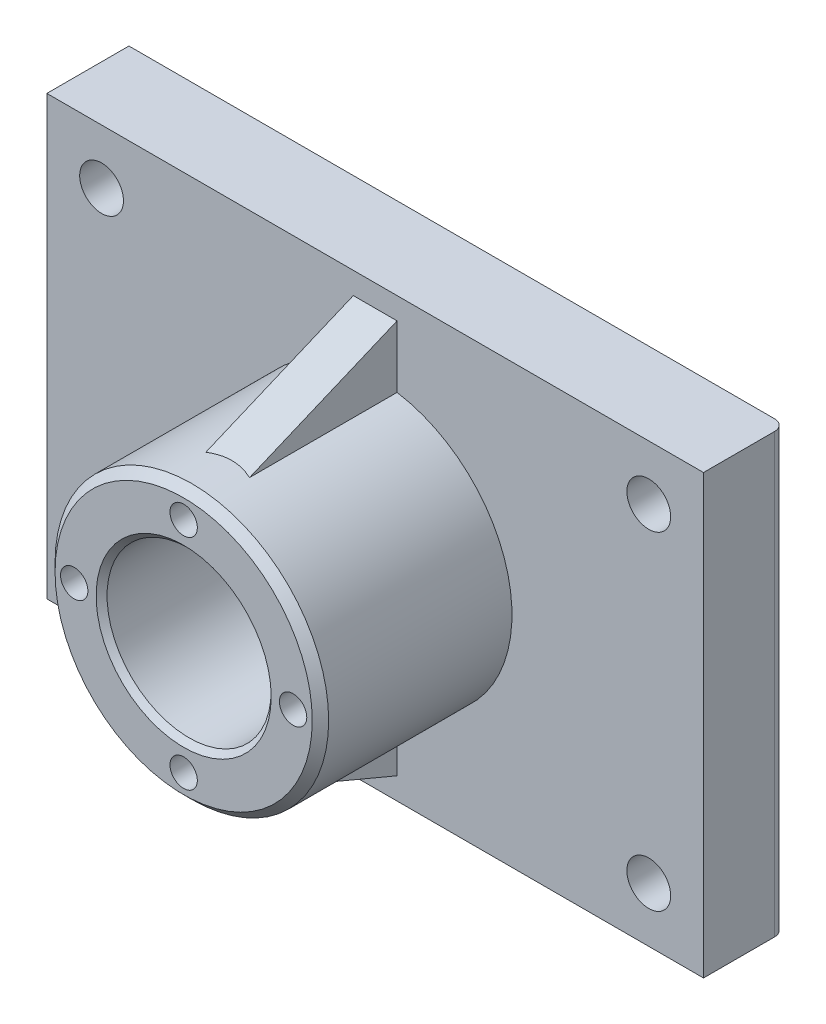
ISO-10303-21;
HEADER;
FILE_DESCRIPTION(('STEP AP214'),'2;1');
FILE_NAME('part.step','',(''),(''),'','','');
FILE_SCHEMA(('AUTOMOTIVE_DESIGN { 1 0 10303 214 1 1 1 1 }'));
ENDSEC;
DATA;
#1=APPLICATION_CONTEXT('core data for automotive mechanical design processes');
#2=APPLICATION_PROTOCOL_DEFINITION('international standard','automotive_design',2000,#1);
#3=PRODUCT_CONTEXT('',#1,'mechanical');
#4=PRODUCT('Part','Part','',(#3));
#5=PRODUCT_RELATED_PRODUCT_CATEGORY('part','',(#4));
#6=PRODUCT_DEFINITION_FORMATION('','',#4);
#7=PRODUCT_DEFINITION_CONTEXT('part definition',#1,'design');
#8=PRODUCT_DEFINITION('design','',#6,#7);
#9=PRODUCT_DEFINITION_SHAPE('','',#8);
#10=(LENGTH_UNIT() NAMED_UNIT(*) SI_UNIT(.MILLI.,.METRE.));
#11=(NAMED_UNIT(*) PLANE_ANGLE_UNIT() SI_UNIT($,.RADIAN.));
#12=(NAMED_UNIT(*) SI_UNIT($,.STERADIAN.) SOLID_ANGLE_UNIT());
#13=UNCERTAINTY_MEASURE_WITH_UNIT(LENGTH_MEASURE(1.E-05),#10,'distance_accuracy_value','');
#14=(GEOMETRIC_REPRESENTATION_CONTEXT(3) GLOBAL_UNCERTAINTY_ASSIGNED_CONTEXT((#13)) GLOBAL_UNIT_ASSIGNED_CONTEXT((#10,
#11,#12)) REPRESENTATION_CONTEXT('',''));
#15=CARTESIAN_POINT('',(0.,0.,0.));
#16=DIRECTION('',(0.,0.,1.));
#17=DIRECTION('',(1.,0.,0.));
#18=AXIS2_PLACEMENT_3D('',#15,#16,#17);
#19=CARTESIAN_POINT('',(-60.,-40.,15.));
#20=DIRECTION('',(1.,0.,0.));
#21=DIRECTION('',(0.,0.,-1.));
#22=AXIS2_PLACEMENT_3D('',#19,#20,#21);
#23=PLANE('',#22);
#24=DIRECTION('',(0.,-1.,0.));
#25=VECTOR('',#24,1.);
#26=CARTESIAN_POINT('',(-60.,-40.,0.));
#27=LINE('',#26,#25);
#28=CARTESIAN_POINT('',(-60.,40.,0.));
#29=VERTEX_POINT('',#28);
#30=CARTESIAN_POINT('',(-60.,-40.,0.));
#31=VERTEX_POINT('',#30);
#32=EDGE_CURVE('E229',#29,#31,#27,.T.);
#33=ORIENTED_EDGE('',*,*,#32,.T.);
#34=DIRECTION('',(0.,0.,-1.));
#35=VECTOR('',#34,1.);
#36=CARTESIAN_POINT('',(-60.,-40.,15.));
#37=LINE('',#36,#35);
#38=CARTESIAN_POINT('',(-60.,-40.,15.));
#39=VERTEX_POINT('',#38);
#40=EDGE_CURVE('E254',#39,#31,#37,.T.);
#41=ORIENTED_EDGE('',*,*,#40,.F.);
#42=DIRECTION('',(0.,-1.,0.));
#43=VECTOR('',#42,1.);
#44=CARTESIAN_POINT('',(-60.,-40.,15.));
#45=LINE('',#44,#43);
#46=CARTESIAN_POINT('',(-60.,40.,15.));
#47=VERTEX_POINT('',#46);
#48=EDGE_CURVE('E231',#47,#39,#45,.T.);
#49=ORIENTED_EDGE('',*,*,#48,.F.);
#50=DIRECTION('',(0.,0.,-1.));
#51=VECTOR('',#50,1.);
#52=CARTESIAN_POINT('',(-60.,40.,15.));
#53=LINE('',#52,#51);
#54=EDGE_CURVE('E241',#47,#29,#53,.T.);
#55=ORIENTED_EDGE('',*,*,#54,.T.);
#56=EDGE_LOOP('',(#33,#41,#49,#55));
#57=FACE_BOUND('',#56,.T.);
#58=ADVANCED_FACE('F43',(#57),#23,.F.);
#59=CARTESIAN_POINT('',(-60.,-40.,15.));
#60=DIRECTION('',(0.,1.,0.));
#61=DIRECTION('',(0.,0.,1.));
#62=AXIS2_PLACEMENT_3D('',#59,#60,#61);
#63=PLANE('',#62);
#64=DIRECTION('',(1.,0.,0.));
#65=VECTOR('',#64,1.);
#66=CARTESIAN_POINT('',(-60.,-40.,0.));
#67=LINE('',#66,#65);
#68=CARTESIAN_POINT('',(58.,-40.,0.));
#69=VERTEX_POINT('',#68);
#70=EDGE_CURVE('E244',#31,#69,#67,.T.);
#71=ORIENTED_EDGE('',*,*,#70,.T.);
#72=CARTESIAN_POINT('',(58.,-40.,2.));
#73=DIRECTION('',(0.,1.,0.));
#74=DIRECTION('',(0.,0.,1.));
#75=AXIS2_PLACEMENT_3D('',#72,#73,#74);
#76=CIRCLE('',#75,2.);
#77=CARTESIAN_POINT('',(60.,-40.,2.));
#78=VERTEX_POINT('',#77);
#79=EDGE_CURVE('E11',#69,#78,#76,.F.);
#80=ORIENTED_EDGE('',*,*,#79,.T.);
#81=DIRECTION('',(0.,0.,-1.));
#82=VECTOR('',#81,1.);
#83=CARTESIAN_POINT('',(60.,-40.,15.));
#84=LINE('',#83,#82);
#85=CARTESIAN_POINT('',(60.,-40.,15.));
#86=VERTEX_POINT('',#85);
#87=EDGE_CURVE('E251',#86,#78,#84,.T.);
#88=ORIENTED_EDGE('',*,*,#87,.F.);
#89=DIRECTION('',(1.,0.,0.));
#90=VECTOR('',#89,1.);
#91=CARTESIAN_POINT('',(-60.,-40.,15.));
#92=LINE('',#91,#90);
#93=EDGE_CURVE('E234',#39,#86,#92,.T.);
#94=ORIENTED_EDGE('',*,*,#93,.F.);
#95=ORIENTED_EDGE('',*,*,#40,.T.);
#96=EDGE_LOOP('',(#71,#80,#88,#94,#95));
#97=FACE_BOUND('',#96,.T.);
#98=ADVANCED_FACE('F286',(#97),#63,.F.);
#99=CARTESIAN_POINT('',(60.,-40.,15.));
#100=DIRECTION('',(-1.,0.,0.));
#101=DIRECTION('',(0.,0.,1.));
#102=AXIS2_PLACEMENT_3D('',#99,#100,#101);
#103=PLANE('',#102);
#104=ORIENTED_EDGE('',*,*,#87,.T.);
#105=DIRECTION('',(0.,1.,0.));
#106=VECTOR('',#105,1.);
#107=CARTESIAN_POINT('',(60.,40.,2.));
#108=LINE('',#107,#106);
#109=CARTESIAN_POINT('',(60.,40.,2.));
#110=VERTEX_POINT('',#109);
#111=EDGE_CURVE('E268',#78,#110,#108,.T.);
#112=ORIENTED_EDGE('',*,*,#111,.T.);
#113=DIRECTION('',(0.,0.,-1.));
#114=VECTOR('',#113,1.);
#115=CARTESIAN_POINT('',(60.,40.,15.));
#116=LINE('',#115,#114);
#117=CARTESIAN_POINT('',(60.,40.,15.));
#118=VERTEX_POINT('',#117);
#119=EDGE_CURVE('E249',#118,#110,#116,.T.);
#120=ORIENTED_EDGE('',*,*,#119,.F.);
#121=DIRECTION('',(0.,1.,0.));
#122=VECTOR('',#121,1.);
#123=CARTESIAN_POINT('',(60.,-40.,15.));
#124=LINE('',#123,#122);
#125=EDGE_CURVE('E237',#86,#118,#124,.T.);
#126=ORIENTED_EDGE('',*,*,#125,.F.);
#127=EDGE_LOOP('',(#104,#112,#120,#126));
#128=FACE_BOUND('',#127,.T.);
#129=ADVANCED_FACE('F274',(#128),#103,.F.);
#130=CARTESIAN_POINT('',(-60.,40.,15.));
#131=DIRECTION('',(0.,-1.,0.));
#132=DIRECTION('',(0.,0.,-1.));
#133=AXIS2_PLACEMENT_3D('',#130,#131,#132);
#134=PLANE('',#133);
#135=ORIENTED_EDGE('',*,*,#119,.T.);
#136=CARTESIAN_POINT('',(58.,40.,2.));
#137=DIRECTION('',(0.,-1.,0.));
#138=DIRECTION('',(0.,0.,-1.));
#139=AXIS2_PLACEMENT_3D('',#136,#137,#138);
#140=CIRCLE('',#139,2.);
#141=CARTESIAN_POINT('',(58.,40.,0.));
#142=VERTEX_POINT('',#141);
#143=EDGE_CURVE('E65',#110,#142,#140,.F.);
#144=ORIENTED_EDGE('',*,*,#143,.T.);
#145=DIRECTION('',(-1.,0.,0.));
#146=VECTOR('',#145,1.);
#147=CARTESIAN_POINT('',(-60.,40.,0.));
#148=LINE('',#147,#146);
#149=EDGE_CURVE('E235',#142,#29,#148,.T.);
#150=ORIENTED_EDGE('',*,*,#149,.T.);
#151=ORIENTED_EDGE('',*,*,#54,.F.);
#152=DIRECTION('',(-1.,0.,0.));
#153=VECTOR('',#152,1.);
#154=CARTESIAN_POINT('',(-60.,40.,15.));
#155=LINE('',#154,#153);
#156=EDGE_CURVE('E239',#118,#47,#155,.T.);
#157=ORIENTED_EDGE('',*,*,#156,.F.);
#158=EDGE_LOOP('',(#135,#144,#150,#151,#157));
#159=FACE_BOUND('',#158,.T.);
#160=ADVANCED_FACE('F280',(#159),#134,.F.);
#161=CARTESIAN_POINT('',(0.,0.,15.));
#162=DIRECTION('',(0.,0.,-1.));
#163=DIRECTION('',(-1.,0.,0.));
#164=AXIS2_PLACEMENT_3D('',#161,#162,#163);
#165=PLANE('',#164);
#166=DIRECTION('',(1.,0.,0.));
#167=VECTOR('',#166,1.);
#168=CARTESIAN_POINT('',(0.,36.,15.));
#169=LINE('',#168,#167);
#170=CARTESIAN_POINT('',(-4.,36.,15.));
#171=VERTEX_POINT('',#170);
#172=CARTESIAN_POINT('',(4.,36.,15.));
#173=VERTEX_POINT('',#172);
#174=EDGE_CURVE('E177',#171,#173,#169,.T.);
#175=ORIENTED_EDGE('',*,*,#174,.T.);
#176=DIRECTION('',(0.,-1.,0.));
#177=VECTOR('',#176,1.);
#178=CARTESIAN_POINT('',(4.,0.,15.));
#179=LINE('',#178,#177);
#180=CARTESIAN_POINT('',(4.,24.6779253585061,15.));
#181=VERTEX_POINT('',#180);
#182=EDGE_CURVE('E171',#173,#181,#179,.T.);
#183=ORIENTED_EDGE('',*,*,#182,.T.);
#184=CARTESIAN_POINT('',(0.,0.,15.));
#185=DIRECTION('',(0.,0.,1.));
#186=DIRECTION('',(1.,0.,0.));
#187=AXIS2_PLACEMENT_3D('',#184,#185,#186);
#188=CIRCLE('',#187,25.);
#189=CARTESIAN_POINT('',(4.,-24.6779253585061,15.));
#190=VERTEX_POINT('',#189);
#191=EDGE_CURVE('E134',#190,#181,#188,.T.);
#192=ORIENTED_EDGE('',*,*,#191,.F.);
#193=DIRECTION('',(0.,-1.,0.));
#194=VECTOR('',#193,1.);
#195=CARTESIAN_POINT('',(4.,0.,15.));
#196=LINE('',#195,#194);
#197=CARTESIAN_POINT('',(4.,-36.,15.));
#198=VERTEX_POINT('',#197);
#199=EDGE_CURVE('E155',#190,#198,#196,.T.);
#200=ORIENTED_EDGE('',*,*,#199,.T.);
#201=DIRECTION('',(1.,0.,0.));
#202=VECTOR('',#201,1.);
#203=CARTESIAN_POINT('',(0.,-36.,15.));
#204=LINE('',#203,#202);
#205=CARTESIAN_POINT('',(-4.,-36.,15.));
#206=VERTEX_POINT('',#205);
#207=EDGE_CURVE('E141',#198,#206,#204,.F.);
#208=ORIENTED_EDGE('',*,*,#207,.T.);
#209=DIRECTION('',(0.,-1.,0.));
#210=VECTOR('',#209,1.);
#211=CARTESIAN_POINT('',(-4.,0.,15.));
#212=LINE('',#211,#210);
#213=CARTESIAN_POINT('',(-4.,-24.6779253585061,15.));
#214=VERTEX_POINT('',#213);
#215=EDGE_CURVE('E137',#214,#206,#212,.T.);
#216=ORIENTED_EDGE('',*,*,#215,.F.);
#217=CARTESIAN_POINT('',(-4.,24.6779253585061,15.));
#218=VERTEX_POINT('',#217);
#219=EDGE_CURVE('E123',#218,#214,#188,.T.);
#220=ORIENTED_EDGE('',*,*,#219,.F.);
#221=DIRECTION('',(0.,-1.,0.));
#222=VECTOR('',#221,1.);
#223=CARTESIAN_POINT('',(-4.,0.,15.));
#224=LINE('',#223,#222);
#225=EDGE_CURVE('E167',#171,#218,#224,.T.);
#226=ORIENTED_EDGE('',*,*,#225,.F.);
#227=EDGE_LOOP('',(#175,#183,#192,#200,#208,#216,#220,#226));
#228=FACE_BOUND('',#227,.T.);
#229=ORIENTED_EDGE('',*,*,#156,.T.);
#230=ORIENTED_EDGE('',*,*,#48,.T.);
#231=ORIENTED_EDGE('',*,*,#93,.T.);
#232=ORIENTED_EDGE('',*,*,#125,.T.);
#233=EDGE_LOOP('',(#229,#230,#231,#232));
#234=FACE_BOUND('',#233,.T.);
#235=CARTESIAN_POINT('',(50.,-30.,15.));
#236=DIRECTION('',(0.,0.,-1.));
#237=DIRECTION('',(1.,0.,0.));
#238=AXIS2_PLACEMENT_3D('',#235,#236,#237);
#239=CIRCLE('',#238,4.);
#240=CARTESIAN_POINT('',(54.,-30.,15.));
#241=VERTEX_POINT('',#240);
#242=EDGE_CURVE('E201',#241,#241,#239,.T.);
#243=ORIENTED_EDGE('',*,*,#242,.T.);
#244=EDGE_LOOP('',(#243));
#245=FACE_BOUND('',#244,.T.);
#246=CARTESIAN_POINT('',(-50.,-30.,15.));
#247=DIRECTION('',(0.,0.,-1.));
#248=DIRECTION('',(1.,0.,0.));
#249=AXIS2_PLACEMENT_3D('',#246,#247,#248);
#250=CIRCLE('',#249,4.);
#251=CARTESIAN_POINT('',(-46.,-30.,15.));
#252=VERTEX_POINT('',#251);
#253=EDGE_CURVE('E207',#252,#252,#250,.T.);
#254=ORIENTED_EDGE('',*,*,#253,.T.);
#255=EDGE_LOOP('',(#254));
#256=FACE_BOUND('',#255,.T.);
#257=CARTESIAN_POINT('',(50.,30.,15.));
#258=DIRECTION('',(0.,0.,1.));
#259=DIRECTION('',(1.,0.,0.));
#260=AXIS2_PLACEMENT_3D('',#257,#258,#259);
#261=CIRCLE('',#260,4.);
#262=CARTESIAN_POINT('',(54.,30.,15.));
#263=VERTEX_POINT('',#262);
#264=EDGE_CURVE('E213',#263,#263,#261,.T.);
#265=ORIENTED_EDGE('',*,*,#264,.F.);
#266=EDGE_LOOP('',(#265));
#267=FACE_BOUND('',#266,.T.);
#268=CARTESIAN_POINT('',(-50.,30.,15.));
#269=DIRECTION('',(0.,0.,1.));
#270=DIRECTION('',(1.,0.,0.));
#271=AXIS2_PLACEMENT_3D('',#268,#269,#270);
#272=CIRCLE('',#271,4.);
#273=CARTESIAN_POINT('',(-46.,30.,15.));
#274=VERTEX_POINT('',#273);
#275=EDGE_CURVE('E219',#274,#274,#272,.T.);
#276=ORIENTED_EDGE('',*,*,#275,.F.);
#277=EDGE_LOOP('',(#276));
#278=FACE_BOUND('',#277,.T.);
#279=ADVANCED_FACE('F138',(#228,#234,#245,#256,#267,#278),#165,.F.);
#280=CARTESIAN_POINT('',(0.,0.,0.));
#281=DIRECTION('',(0.,0.,-1.));
#282=DIRECTION('',(-1.,0.,0.));
#283=AXIS2_PLACEMENT_3D('',#280,#281,#282);
#284=PLANE('',#283);
#285=CARTESIAN_POINT('',(0.,0.,0.));
#286=DIRECTION('',(0.,0.,1.));
#287=DIRECTION('',(1.,0.,0.));
#288=AXIS2_PLACEMENT_3D('',#285,#286,#287);
#289=CIRCLE('',#288,15.);
#290=CARTESIAN_POINT('',(15.,0.,0.));
#291=VERTEX_POINT('',#290);
#292=EDGE_CURVE('E225',#291,#291,#289,.T.);
#293=ORIENTED_EDGE('',*,*,#292,.T.);
#294=EDGE_LOOP('',(#293));
#295=FACE_BOUND('',#294,.T.);
#296=ORIENTED_EDGE('',*,*,#149,.F.);
#297=DIRECTION('',(0.,1.,0.));
#298=VECTOR('',#297,1.);
#299=CARTESIAN_POINT('',(58.,-40.,0.));
#300=LINE('',#299,#298);
#301=EDGE_CURVE('E51',#142,#69,#300,.F.);
#302=ORIENTED_EDGE('',*,*,#301,.T.);
#303=ORIENTED_EDGE('',*,*,#70,.F.);
#304=ORIENTED_EDGE('',*,*,#32,.F.);
#305=EDGE_LOOP('',(#296,#302,#303,#304));
#306=FACE_BOUND('',#305,.T.);
#307=CARTESIAN_POINT('',(50.,-30.,0.));
#308=DIRECTION('',(0.,0.,-1.));
#309=DIRECTION('',(1.,0.,0.));
#310=AXIS2_PLACEMENT_3D('',#307,#308,#309);
#311=CIRCLE('',#310,4.);
#312=CARTESIAN_POINT('',(54.,-30.,0.));
#313=VERTEX_POINT('',#312);
#314=EDGE_CURVE('E204',#313,#313,#311,.T.);
#315=ORIENTED_EDGE('',*,*,#314,.F.);
#316=EDGE_LOOP('',(#315));
#317=FACE_BOUND('',#316,.T.);
#318=CARTESIAN_POINT('',(50.,30.,0.));
#319=DIRECTION('',(0.,0.,1.));
#320=DIRECTION('',(1.,0.,0.));
#321=AXIS2_PLACEMENT_3D('',#318,#319,#320);
#322=CIRCLE('',#321,4.);
#323=CARTESIAN_POINT('',(54.,30.,0.));
#324=VERTEX_POINT('',#323);
#325=EDGE_CURVE('E216',#324,#324,#322,.T.);
#326=ORIENTED_EDGE('',*,*,#325,.T.);
#327=EDGE_LOOP('',(#326));
#328=FACE_BOUND('',#327,.T.);
#329=CARTESIAN_POINT('',(-50.,-30.,0.));
#330=DIRECTION('',(0.,0.,-1.));
#331=DIRECTION('',(1.,0.,0.));
#332=AXIS2_PLACEMENT_3D('',#329,#330,#331);
#333=CIRCLE('',#332,4.);
#334=CARTESIAN_POINT('',(-46.,-30.,0.));
#335=VERTEX_POINT('',#334);
#336=EDGE_CURVE('E210',#335,#335,#333,.T.);
#337=ORIENTED_EDGE('',*,*,#336,.F.);
#338=EDGE_LOOP('',(#337));
#339=FACE_BOUND('',#338,.T.);
#340=CARTESIAN_POINT('',(-50.,30.,0.));
#341=DIRECTION('',(0.,0.,1.));
#342=DIRECTION('',(1.,0.,0.));
#343=AXIS2_PLACEMENT_3D('',#340,#341,#342);
#344=CIRCLE('',#343,4.);
#345=CARTESIAN_POINT('',(-46.,30.,0.));
#346=VERTEX_POINT('',#345);
#347=EDGE_CURVE('E222',#346,#346,#344,.T.);
#348=ORIENTED_EDGE('',*,*,#347,.T.);
#349=EDGE_LOOP('',(#348));
#350=FACE_BOUND('',#349,.T.);
#351=ADVANCED_FACE('F389',(#295,#306,#317,#328,#339,#350),#284,.T.);
#352=CARTESIAN_POINT('',(0.,0.,50.));
#353=DIRECTION('',(0.,0.,-1.));
#354=DIRECTION('',(-1.,0.,0.));
#355=AXIS2_PLACEMENT_3D('',#352,#353,#354);
#356=CYLINDRICAL_SURFACE('',#355,25.);
#357=CARTESIAN_POINT('',(0.,0.,48.5));
#358=DIRECTION('',(0.,0.,1.));
#359=DIRECTION('',(1.,0.,0.));
#360=AXIS2_PLACEMENT_3D('',#357,#358,#359);
#361=CIRCLE('',#360,25.);
#362=CARTESIAN_POINT('',(-25.,0.,48.5));
#363=VERTEX_POINT('',#362);
#364=EDGE_CURVE('E259',#363,#363,#361,.F.);
#365=ORIENTED_EDGE('',*,*,#364,.T.);
#366=EDGE_LOOP('',(#365));
#367=FACE_BOUND('',#366,.T.);
#368=DIRECTION('',(0.,0.,-1.));
#369=VECTOR('',#368,1.);
#370=CARTESIAN_POINT('',(4.,24.6779253585061,50.));
#371=LINE('',#370,#369);
#372=CARTESIAN_POINT('',(4.,24.6779253585061,41.9573205749854));
#373=VERTEX_POINT('',#372);
#374=EDGE_CURVE('E169',#181,#373,#371,.F.);
#375=ORIENTED_EDGE('',*,*,#374,.T.);
#376=CARTESIAN_POINT('',(0.,0.,100.714285714286));
#377=DIRECTION('',(0.,0.921982105607361,0.387232484355092));
#378=DIRECTION('',(0.,0.387232484355092,-0.921982105607361));
#379=AXIS2_PLACEMENT_3D('',#376,#377,#378);
#380=ELLIPSE('',#379,64.5606993474107,25.);
#381=CARTESIAN_POINT('',(-4.,24.6779253585061,41.9573205749854));
#382=VERTEX_POINT('',#381);
#383=EDGE_CURVE('E174',#373,#382,#380,.T.);
#384=ORIENTED_EDGE('',*,*,#383,.T.);
#385=DIRECTION('',(0.,0.,-1.));
#386=VECTOR('',#385,1.);
#387=CARTESIAN_POINT('',(-4.,24.6779253585061,50.));
#388=LINE('',#387,#386);
#389=EDGE_CURVE('E130',#218,#382,#388,.F.);
#390=ORIENTED_EDGE('',*,*,#389,.F.);
#391=ORIENTED_EDGE('',*,*,#219,.T.);
#392=DIRECTION('',(0.,0.,-1.));
#393=VECTOR('',#392,1.);
#394=CARTESIAN_POINT('',(-4.,-24.6779253585061,50.));
#395=LINE('',#394,#393);
#396=CARTESIAN_POINT('',(-4.,-24.6779253585061,41.9573205749854));
#397=VERTEX_POINT('',#396);
#398=EDGE_CURVE('E127',#397,#214,#395,.T.);
#399=ORIENTED_EDGE('',*,*,#398,.F.);
#400=CARTESIAN_POINT('',(0.,0.,100.714285714286));
#401=DIRECTION('',(0.,0.921982105607361,-0.387232484355092));
#402=DIRECTION('',(0.,-0.387232484355092,-0.921982105607361));
#403=AXIS2_PLACEMENT_3D('',#400,#401,#402);
#404=ELLIPSE('',#403,64.5606993474107,25.);
#405=CARTESIAN_POINT('',(4.,-24.6779253585061,41.9573205749854));
#406=VERTEX_POINT('',#405);
#407=EDGE_CURVE('E157',#397,#406,#404,.F.);
#408=ORIENTED_EDGE('',*,*,#407,.T.);
#409=DIRECTION('',(0.,0.,-1.));
#410=VECTOR('',#409,1.);
#411=CARTESIAN_POINT('',(4.,-24.6779253585061,50.));
#412=LINE('',#411,#410);
#413=EDGE_CURVE('E145',#406,#190,#412,.T.);
#414=ORIENTED_EDGE('',*,*,#413,.T.);
#415=ORIENTED_EDGE('',*,*,#191,.T.);
#416=EDGE_LOOP('',(#375,#384,#390,#391,#399,#408,#414,#415));
#417=FACE_BOUND('',#416,.T.);
#418=ADVANCED_FACE('F125',(#367,#417),#356,.T.);
#419=CARTESIAN_POINT('',(0.,0.,50.));
#420=DIRECTION('',(0.,0.,1.));
#421=DIRECTION('',(1.,0.,0.));
#422=AXIS2_PLACEMENT_3D('',#419,#420,#421);
#423=PLANE('',#422);
#424=CARTESIAN_POINT('',(0.,-20.,50.));
#425=DIRECTION('',(0.,0.,1.));
#426=DIRECTION('',(0.,-1.,0.));
#427=AXIS2_PLACEMENT_3D('',#424,#425,#426);
#428=CIRCLE('',#427,2.5);
#429=CARTESIAN_POINT('',(0.,-22.5,50.));
#430=VERTEX_POINT('',#429);
#431=EDGE_CURVE('E184',#430,#430,#428,.T.);
#432=ORIENTED_EDGE('',*,*,#431,.F.);
#433=EDGE_LOOP('',(#432));
#434=FACE_BOUND('',#433,.T.);
#435=CARTESIAN_POINT('',(0.,0.,50.));
#436=DIRECTION('',(0.,0.,1.));
#437=DIRECTION('',(1.,0.,0.));
#438=AXIS2_PLACEMENT_3D('',#435,#436,#437);
#439=CIRCLE('',#438,16.);
#440=CARTESIAN_POINT('',(16.,0.,50.));
#441=VERTEX_POINT('',#440);
#442=EDGE_CURVE('E265',#441,#441,#439,.F.);
#443=ORIENTED_EDGE('',*,*,#442,.T.);
#444=EDGE_LOOP('',(#443));
#445=FACE_BOUND('',#444,.T.);
#446=CARTESIAN_POINT('',(0.,0.,50.));
#447=DIRECTION('',(0.,0.,1.));
#448=DIRECTION('',(1.,0.,0.));
#449=AXIS2_PLACEMENT_3D('',#446,#447,#448);
#450=CIRCLE('',#449,23.5);
#451=CARTESIAN_POINT('',(-23.5,0.,50.));
#452=VERTEX_POINT('',#451);
#453=EDGE_CURVE('E133',#452,#452,#450,.T.);
#454=ORIENTED_EDGE('',*,*,#453,.T.);
#455=EDGE_LOOP('',(#454));
#456=FACE_BOUND('',#455,.T.);
#457=CARTESIAN_POINT('',(-20.,0.,50.));
#458=DIRECTION('',(0.,0.,1.));
#459=DIRECTION('',(-1.,0.,0.));
#460=AXIS2_PLACEMENT_3D('',#457,#458,#459);
#461=CIRCLE('',#460,2.5);
#462=CARTESIAN_POINT('',(-22.5,0.,50.));
#463=VERTEX_POINT('',#462);
#464=EDGE_CURVE('E190',#463,#463,#461,.T.);
#465=ORIENTED_EDGE('',*,*,#464,.F.);
#466=EDGE_LOOP('',(#465));
#467=FACE_BOUND('',#466,.T.);
#468=CARTESIAN_POINT('',(20.,0.,50.));
#469=DIRECTION('',(0.,0.,1.));
#470=DIRECTION('',(1.,0.,0.));
#471=AXIS2_PLACEMENT_3D('',#468,#469,#470);
#472=CIRCLE('',#471,2.5);
#473=CARTESIAN_POINT('',(22.5,0.,50.));
#474=VERTEX_POINT('',#473);
#475=EDGE_CURVE('E183',#474,#474,#472,.T.);
#476=ORIENTED_EDGE('',*,*,#475,.F.);
#477=EDGE_LOOP('',(#476));
#478=FACE_BOUND('',#477,.T.);
#479=CARTESIAN_POINT('',(0.,20.,50.));
#480=DIRECTION('',(0.,0.,1.));
#481=DIRECTION('',(0.,1.,0.));
#482=AXIS2_PLACEMENT_3D('',#479,#480,#481);
#483=CIRCLE('',#482,2.5);
#484=CARTESIAN_POINT('',(0.,22.5,50.));
#485=VERTEX_POINT('',#484);
#486=EDGE_CURVE('E179',#485,#485,#483,.T.);
#487=ORIENTED_EDGE('',*,*,#486,.F.);
#488=EDGE_LOOP('',(#487));
#489=FACE_BOUND('',#488,.T.);
#490=ADVANCED_FACE('F329',(#434,#445,#456,#467,#478,#489),#423,.T.);
#491=CARTESIAN_POINT('',(0.,0.,0.));
#492=DIRECTION('',(0.,0.,1.));
#493=DIRECTION('',(1.,0.,0.));
#494=AXIS2_PLACEMENT_3D('',#491,#492,#493);
#495=CYLINDRICAL_SURFACE('',#494,15.);
#496=ORIENTED_EDGE('',*,*,#292,.F.);
#497=EDGE_LOOP('',(#496));
#498=FACE_BOUND('',#497,.T.);
#499=CARTESIAN_POINT('',(0.,0.,49.));
#500=DIRECTION('',(0.,0.,1.));
#501=DIRECTION('',(1.,0.,0.));
#502=AXIS2_PLACEMENT_3D('',#499,#500,#501);
#503=CIRCLE('',#502,15.);
#504=CARTESIAN_POINT('',(15.,0.,49.));
#505=VERTEX_POINT('',#504);
#506=EDGE_CURVE('E262',#505,#505,#503,.T.);
#507=ORIENTED_EDGE('',*,*,#506,.T.);
#508=EDGE_LOOP('',(#507));
#509=FACE_BOUND('',#508,.T.);
#510=ADVANCED_FACE('F332',(#498,#509),#495,.F.);
#511=CARTESIAN_POINT('',(-50.,30.,0.));
#512=DIRECTION('',(0.,0.,1.));
#513=DIRECTION('',(1.,0.,0.));
#514=AXIS2_PLACEMENT_3D('',#511,#512,#513);
#515=CYLINDRICAL_SURFACE('',#514,4.);
#516=ORIENTED_EDGE('',*,*,#347,.F.);
#517=EDGE_LOOP('',(#516));
#518=FACE_BOUND('',#517,.T.);
#519=ORIENTED_EDGE('',*,*,#275,.T.);
#520=EDGE_LOOP('',(#519));
#521=FACE_BOUND('',#520,.T.);
#522=ADVANCED_FACE('F380',(#518,#521),#515,.F.);
#523=CARTESIAN_POINT('',(50.,30.,0.));
#524=DIRECTION('',(0.,0.,1.));
#525=DIRECTION('',(1.,0.,0.));
#526=AXIS2_PLACEMENT_3D('',#523,#524,#525);
#527=CYLINDRICAL_SURFACE('',#526,4.);
#528=ORIENTED_EDGE('',*,*,#325,.F.);
#529=EDGE_LOOP('',(#528));
#530=FACE_BOUND('',#529,.T.);
#531=ORIENTED_EDGE('',*,*,#264,.T.);
#532=EDGE_LOOP('',(#531));
#533=FACE_BOUND('',#532,.T.);
#534=ADVANCED_FACE('F376',(#530,#533),#527,.F.);
#535=CARTESIAN_POINT('',(-50.,-30.,0.));
#536=DIRECTION('',(0.,0.,1.));
#537=DIRECTION('',(1.,0.,0.));
#538=AXIS2_PLACEMENT_3D('',#535,#536,#537);
#539=CYLINDRICAL_SURFACE('',#538,4.);
#540=ORIENTED_EDGE('',*,*,#336,.T.);
#541=EDGE_LOOP('',(#540));
#542=FACE_BOUND('',#541,.T.);
#543=ORIENTED_EDGE('',*,*,#253,.F.);
#544=EDGE_LOOP('',(#543));
#545=FACE_BOUND('',#544,.T.);
#546=ADVANCED_FACE('F372',(#542,#545),#539,.F.);
#547=CARTESIAN_POINT('',(50.,-30.,0.));
#548=DIRECTION('',(0.,0.,1.));
#549=DIRECTION('',(1.,0.,0.));
#550=AXIS2_PLACEMENT_3D('',#547,#548,#549);
#551=CYLINDRICAL_SURFACE('',#550,4.);
#552=ORIENTED_EDGE('',*,*,#314,.T.);
#553=EDGE_LOOP('',(#552));
#554=FACE_BOUND('',#553,.T.);
#555=ORIENTED_EDGE('',*,*,#242,.F.);
#556=EDGE_LOOP('',(#555));
#557=FACE_BOUND('',#556,.T.);
#558=ADVANCED_FACE('F368',(#554,#557),#551,.F.);
#559=CARTESIAN_POINT('',(20.,0.,38.));
#560=DIRECTION('',(0.,0.,1.));
#561=DIRECTION('',(1.,0.,0.));
#562=AXIS2_PLACEMENT_3D('',#559,#560,#561);
#563=CYLINDRICAL_SURFACE('',#562,2.5);
#564=CARTESIAN_POINT('',(20.,0.,38.));
#565=DIRECTION('',(0.,0.,1.));
#566=DIRECTION('',(1.,0.,0.));
#567=AXIS2_PLACEMENT_3D('',#564,#565,#566);
#568=CIRCLE('',#567,2.5);
#569=CARTESIAN_POINT('',(22.5,0.,38.));
#570=VERTEX_POINT('',#569);
#571=EDGE_CURVE('E198',#570,#570,#568,.T.);
#572=ORIENTED_EDGE('',*,*,#571,.F.);
#573=EDGE_LOOP('',(#572));
#574=FACE_BOUND('',#573,.T.);
#575=ORIENTED_EDGE('',*,*,#475,.T.);
#576=EDGE_LOOP('',(#575));
#577=FACE_BOUND('',#576,.T.);
#578=ADVANCED_FACE('F364',(#574,#577),#563,.F.);
#579=CARTESIAN_POINT('',(20.,0.,38.));
#580=DIRECTION('',(0.,0.,1.));
#581=DIRECTION('',(1.,0.,0.));
#582=AXIS2_PLACEMENT_3D('',#579,#580,#581);
#583=PLANE('',#582);
#584=ORIENTED_EDGE('',*,*,#571,.T.);
#585=EDGE_LOOP('',(#584));
#586=FACE_BOUND('',#585,.T.);
#587=ADVANCED_FACE('F347',(#586),#583,.T.);
#588=CARTESIAN_POINT('',(0.,20.,38.));
#589=DIRECTION('',(0.,0.,1.));
#590=DIRECTION('',(1.,0.,0.));
#591=AXIS2_PLACEMENT_3D('',#588,#589,#590);
#592=CYLINDRICAL_SURFACE('',#591,2.5);
#593=ORIENTED_EDGE('',*,*,#486,.T.);
#594=EDGE_LOOP('',(#593));
#595=FACE_BOUND('',#594,.T.);
#596=CARTESIAN_POINT('',(0.,20.,38.));
#597=DIRECTION('',(0.,0.,1.));
#598=DIRECTION('',(0.,1.,0.));
#599=AXIS2_PLACEMENT_3D('',#596,#597,#598);
#600=CIRCLE('',#599,2.5);
#601=CARTESIAN_POINT('',(0.,22.5,38.));
#602=VERTEX_POINT('',#601);
#603=EDGE_CURVE('E193',#602,#602,#600,.T.);
#604=ORIENTED_EDGE('',*,*,#603,.F.);
#605=EDGE_LOOP('',(#604));
#606=FACE_BOUND('',#605,.T.);
#607=ADVANCED_FACE('F343',(#595,#606),#592,.F.);
#608=CARTESIAN_POINT('',(0.,20.,38.));
#609=DIRECTION('',(0.,0.,1.));
#610=DIRECTION('',(0.,1.,0.));
#611=AXIS2_PLACEMENT_3D('',#608,#609,#610);
#612=PLANE('',#611);
#613=ORIENTED_EDGE('',*,*,#603,.T.);
#614=EDGE_LOOP('',(#613));
#615=FACE_BOUND('',#614,.T.);
#616=ADVANCED_FACE('F346',(#615),#612,.T.);
#617=CARTESIAN_POINT('',(-20.,0.,38.));
#618=DIRECTION('',(0.,0.,1.));
#619=DIRECTION('',(1.,0.,0.));
#620=AXIS2_PLACEMENT_3D('',#617,#618,#619);
#621=CYLINDRICAL_SURFACE('',#620,2.5);
#622=CARTESIAN_POINT('',(-20.,0.,38.));
#623=DIRECTION('',(0.,0.,1.));
#624=DIRECTION('',(-1.,0.,0.));
#625=AXIS2_PLACEMENT_3D('',#622,#623,#624);
#626=CIRCLE('',#625,2.5);
#627=CARTESIAN_POINT('',(-22.5,0.,38.));
#628=VERTEX_POINT('',#627);
#629=EDGE_CURVE('E187',#628,#628,#626,.T.);
#630=ORIENTED_EDGE('',*,*,#629,.F.);
#631=EDGE_LOOP('',(#630));
#632=FACE_BOUND('',#631,.T.);
#633=ORIENTED_EDGE('',*,*,#464,.T.);
#634=EDGE_LOOP('',(#633));
#635=FACE_BOUND('',#634,.T.);
#636=ADVANCED_FACE('F352',(#632,#635),#621,.F.);
#637=CARTESIAN_POINT('',(-20.,0.,38.));
#638=DIRECTION('',(0.,0.,1.));
#639=DIRECTION('',(-1.,0.,0.));
#640=AXIS2_PLACEMENT_3D('',#637,#638,#639);
#641=PLANE('',#640);
#642=ORIENTED_EDGE('',*,*,#629,.T.);
#643=EDGE_LOOP('',(#642));
#644=FACE_BOUND('',#643,.T.);
#645=ADVANCED_FACE('F358',(#644),#641,.T.);
#646=CARTESIAN_POINT('',(0.,-20.,38.));
#647=DIRECTION('',(0.,0.,1.));
#648=DIRECTION('',(1.,0.,0.));
#649=AXIS2_PLACEMENT_3D('',#646,#647,#648);
#650=CYLINDRICAL_SURFACE('',#649,2.5);
#651=ORIENTED_EDGE('',*,*,#431,.T.);
#652=EDGE_LOOP('',(#651));
#653=FACE_BOUND('',#652,.T.);
#654=CARTESIAN_POINT('',(0.,-20.,38.));
#655=DIRECTION('',(0.,0.,1.));
#656=DIRECTION('',(0.,-1.,0.));
#657=AXIS2_PLACEMENT_3D('',#654,#655,#656);
#658=CIRCLE('',#657,2.5);
#659=CARTESIAN_POINT('',(0.,-22.5,38.));
#660=VERTEX_POINT('',#659);
#661=EDGE_CURVE('E180',#660,#660,#658,.T.);
#662=ORIENTED_EDGE('',*,*,#661,.F.);
#663=EDGE_LOOP('',(#662));
#664=FACE_BOUND('',#663,.T.);
#665=ADVANCED_FACE('F497',(#653,#664),#650,.F.);
#666=CARTESIAN_POINT('',(0.,-20.,38.));
#667=DIRECTION('',(0.,0.,1.));
#668=DIRECTION('',(0.,-1.,0.));
#669=AXIS2_PLACEMENT_3D('',#666,#667,#668);
#670=PLANE('',#669);
#671=ORIENTED_EDGE('',*,*,#661,.T.);
#672=EDGE_LOOP('',(#671));
#673=FACE_BOUND('',#672,.T.);
#674=ADVANCED_FACE('F311',(#673),#670,.T.);
#675=CARTESIAN_POINT('',(0.,0.,50.));
#676=DIRECTION('',(0.,0.,-1.));
#677=DIRECTION('',(-1.,0.,0.));
#678=AXIS2_PLACEMENT_3D('',#675,#676,#677);
#679=CONICAL_SURFACE('',#678,23.5,0.785398163397441);
#680=CARTESIAN_POINT('',(-25.,0.,48.5));
#681=CARTESIAN_POINT('',(-24.984375,0.,48.515625));
#682=CARTESIAN_POINT('',(-24.96875,0.,48.53125));
#683=CARTESIAN_POINT('',(-24.9375,0.,48.5625));
#684=CARTESIAN_POINT('',(-24.921875,0.,48.578125));
#685=CARTESIAN_POINT('',(-24.890625,0.,48.609375));
#686=CARTESIAN_POINT('',(-24.875,0.,48.625));
#687=CARTESIAN_POINT('',(-24.84375,0.,48.65625));
#688=CARTESIAN_POINT('',(-24.828125,0.,48.671875));
#689=CARTESIAN_POINT('',(-24.796875,0.,48.703125));
#690=CARTESIAN_POINT('',(-24.78125,0.,48.71875));
#691=CARTESIAN_POINT('',(-24.75,0.,48.75));
#692=CARTESIAN_POINT('',(-24.734375,0.,48.765625));
#693=CARTESIAN_POINT('',(-24.703125,0.,48.796875));
#694=CARTESIAN_POINT('',(-24.6875,0.,48.8125));
#695=CARTESIAN_POINT('',(-24.65625,0.,48.84375));
#696=CARTESIAN_POINT('',(-24.640625,0.,48.859375));
#697=CARTESIAN_POINT('',(-24.609375,0.,48.890625));
#698=CARTESIAN_POINT('',(-24.59375,0.,48.90625));
#699=CARTESIAN_POINT('',(-24.5625,0.,48.9375));
#700=CARTESIAN_POINT('',(-24.546875,0.,48.953125));
#701=CARTESIAN_POINT('',(-24.515625,0.,48.984375));
#702=CARTESIAN_POINT('',(-24.5,0.,49.));
#703=CARTESIAN_POINT('',(-24.46875,0.,49.03125));
#704=CARTESIAN_POINT('',(-24.453125,0.,49.046875));
#705=CARTESIAN_POINT('',(-24.421875,0.,49.078125));
#706=CARTESIAN_POINT('',(-24.40625,0.,49.09375));
#707=CARTESIAN_POINT('',(-24.375,0.,49.125));
#708=CARTESIAN_POINT('',(-24.359375,0.,49.140625));
#709=CARTESIAN_POINT('',(-24.328125,0.,49.171875));
#710=CARTESIAN_POINT('',(-24.3125,0.,49.1875));
#711=CARTESIAN_POINT('',(-24.28125,0.,49.21875));
#712=CARTESIAN_POINT('',(-24.265625,0.,49.234375));
#713=CARTESIAN_POINT('',(-24.234375,0.,49.265625));
#714=CARTESIAN_POINT('',(-24.21875,0.,49.28125));
#715=CARTESIAN_POINT('',(-24.1875,0.,49.3125));
#716=CARTESIAN_POINT('',(-24.171875,0.,49.328125));
#717=CARTESIAN_POINT('',(-24.140625,0.,49.359375));
#718=CARTESIAN_POINT('',(-24.125,0.,49.375));
#719=CARTESIAN_POINT('',(-24.09375,0.,49.40625));
#720=CARTESIAN_POINT('',(-24.078125,0.,49.421875));
#721=CARTESIAN_POINT('',(-24.046875,0.,49.453125));
#722=CARTESIAN_POINT('',(-24.03125,0.,49.46875));
#723=CARTESIAN_POINT('',(-24.,0.,49.5));
#724=CARTESIAN_POINT('',(-23.984375,0.,49.515625));
#725=CARTESIAN_POINT('',(-23.953125,0.,49.546875));
#726=CARTESIAN_POINT('',(-23.9375,0.,49.5625));
#727=CARTESIAN_POINT('',(-23.90625,0.,49.59375));
#728=CARTESIAN_POINT('',(-23.890625,0.,49.609375));
#729=CARTESIAN_POINT('',(-23.859375,0.,49.640625));
#730=CARTESIAN_POINT('',(-23.84375,0.,49.65625));
#731=CARTESIAN_POINT('',(-23.8125,0.,49.6875));
#732=CARTESIAN_POINT('',(-23.796875,0.,49.703125));
#733=CARTESIAN_POINT('',(-23.765625,0.,49.734375));
#734=CARTESIAN_POINT('',(-23.75,0.,49.75));
#735=CARTESIAN_POINT('',(-23.71875,0.,49.78125));
#736=CARTESIAN_POINT('',(-23.703125,0.,49.796875));
#737=CARTESIAN_POINT('',(-23.671875,0.,49.828125));
#738=CARTESIAN_POINT('',(-23.65625,0.,49.84375));
#739=CARTESIAN_POINT('',(-23.625,0.,49.875));
#740=CARTESIAN_POINT('',(-23.609375,0.,49.890625));
#741=CARTESIAN_POINT('',(-23.578125,0.,49.921875));
#742=CARTESIAN_POINT('',(-23.5625,0.,49.9375));
#743=CARTESIAN_POINT('',(-23.53125,0.,49.96875));
#744=CARTESIAN_POINT('',(-23.515625,0.,49.984375));
#745=CARTESIAN_POINT('',(-23.5,0.,50.));
#746=B_SPLINE_CURVE_WITH_KNOTS('',3,(#680,#681,#682,#683,#684,#685,#686,#687,#688,#689,#690,
#691,#692,#693,#694,#695,#696,#697,#698,#699,#700,#701,#702,#703,#704,#705,#706,#707,#708,#709,
#710,#711,#712,#713,#714,#715,#716,#717,#718,#719,#720,#721,#722,#723,#724,#725,#726,#727,#728,
#729,#730,#731,#732,#733,#734,#735,#736,#737,#738,#739,#740,#741,#742,#743,#744,#745),
.UNSPECIFIED.,.F.,.F.,(4,2,2,2,2,2,2,2,2,2,2,2,2,2,2,2,2,2,2,2,2,2,2,2,2,2,2,2,2,2,2,2,4),(0.,
0.0662912607362389,0.132582521472478,0.198873782208717,0.265165042944953,0.331456303681192,
0.397747564417431,0.464038825153665,0.530330085889904,0.596621346626145,0.662912607362379,
0.729203868098618,0.795495128834857,0.861786389571091,0.928077650307332,0.994368911043571,
1.06066017177981,1.12695143251604,1.19324269325228,1.25953395398852,1.32582521472476,
1.392116475461,1.45840773619724,1.52469899693347,1.59099025766971,1.65728151840595,
1.72357277914218,1.78986403987842,1.85615530061466,1.9224465613509,1.98873782208714,
2.05502908282338,2.12132034355962),.UNSPECIFIED.);
#747=EDGE_CURVE('BSEAM305',#363,#452,#746,.T.);
#748=ORIENTED_EDGE('',*,*,#364,.F.);
#749=ORIENTED_EDGE('',*,*,#453,.F.);
#750=ORIENTED_EDGE('',*,*,#747,.T.);
#751=ORIENTED_EDGE('',*,*,#747,.F.);
#752=EDGE_LOOP('',(#748,#750,#749,#751));
#753=FACE_BOUND('',#752,.T.);
#754=ADVANCED_FACE('F305',(#753),#679,.T.);
#755=CARTESIAN_POINT('',(0.,0.,49.));
#756=DIRECTION('',(0.,0.,1.));
#757=DIRECTION('',(1.,0.,0.));
#758=AXIS2_PLACEMENT_3D('',#755,#756,#757);
#759=CONICAL_SURFACE('',#758,15.,0.785398163397455);
#760=ORIENTED_EDGE('',*,*,#506,.F.);
#761=EDGE_LOOP('',(#760));
#762=FACE_BOUND('',#761,.T.);
#763=ORIENTED_EDGE('',*,*,#442,.F.);
#764=EDGE_LOOP('',(#763));
#765=FACE_BOUND('',#764,.T.);
#766=ADVANCED_FACE('F310',(#762,#765),#759,.F.);
#767=CARTESIAN_POINT('',(0.,36.,15.));
#768=DIRECTION('',(0.,0.921982105607361,0.387232484355092));
#769=DIRECTION('',(0.,-0.387232484355092,0.921982105607361));
#770=AXIS2_PLACEMENT_3D('',#767,#768,#769);
#771=PLANE('',#770);
#772=ORIENTED_EDGE('',*,*,#174,.F.);
#773=DIRECTION('',(0.,-0.387232484355092,0.921982105607361));
#774=VECTOR('',#773,1.);
#775=CARTESIAN_POINT('',(-4.,36.,15.));
#776=LINE('',#775,#774);
#777=EDGE_CURVE('E161',#171,#382,#776,.T.);
#778=ORIENTED_EDGE('',*,*,#777,.T.);
#779=ORIENTED_EDGE('',*,*,#383,.F.);
#780=DIRECTION('',(0.,-0.387232484355092,0.921982105607361));
#781=VECTOR('',#780,1.);
#782=CARTESIAN_POINT('',(4.,36.,15.));
#783=LINE('',#782,#781);
#784=EDGE_CURVE('E162',#173,#373,#783,.T.);
#785=ORIENTED_EDGE('',*,*,#784,.F.);
#786=EDGE_LOOP('',(#772,#778,#779,#785));
#787=FACE_BOUND('',#786,.T.);
#788=ADVANCED_FACE('F316',(#787),#771,.T.);
#789=CARTESIAN_POINT('',(4.,0.,25.));
#790=DIRECTION('',(1.,0.,0.));
#791=DIRECTION('',(0.,0.,-1.));
#792=AXIS2_PLACEMENT_3D('',#789,#790,#791);
#793=PLANE('',#792);
#794=ORIENTED_EDGE('',*,*,#182,.F.);
#795=ORIENTED_EDGE('',*,*,#784,.T.);
#796=ORIENTED_EDGE('',*,*,#374,.F.);
#797=EDGE_LOOP('',(#794,#795,#796));
#798=FACE_BOUND('',#797,.T.);
#799=ADVANCED_FACE('F322',(#798),#793,.T.);
#800=CARTESIAN_POINT('',(-4.,0.,25.));
#801=DIRECTION('',(1.,0.,0.));
#802=DIRECTION('',(0.,0.,-1.));
#803=AXIS2_PLACEMENT_3D('',#800,#801,#802);
#804=PLANE('',#803);
#805=ORIENTED_EDGE('',*,*,#777,.F.);
#806=ORIENTED_EDGE('',*,*,#225,.T.);
#807=ORIENTED_EDGE('',*,*,#389,.T.);
#808=EDGE_LOOP('',(#805,#806,#807));
#809=FACE_BOUND('',#808,.T.);
#810=ADVANCED_FACE('F538',(#809),#804,.F.);
#811=CARTESIAN_POINT('',(0.,-36.,15.));
#812=DIRECTION('',(0.,0.921982105607361,-0.387232484355092));
#813=DIRECTION('',(0.,0.387232484355092,0.921982105607361));
#814=AXIS2_PLACEMENT_3D('',#811,#812,#813);
#815=PLANE('',#814);
#816=ORIENTED_EDGE('',*,*,#207,.F.);
#817=DIRECTION('',(0.,0.387232484355092,0.921982105607361));
#818=VECTOR('',#817,1.);
#819=CARTESIAN_POINT('',(4.,-36.,15.));
#820=LINE('',#819,#818);
#821=EDGE_CURVE('E149',#198,#406,#820,.T.);
#822=ORIENTED_EDGE('',*,*,#821,.T.);
#823=ORIENTED_EDGE('',*,*,#407,.F.);
#824=DIRECTION('',(0.,0.387232484355092,0.921982105607361));
#825=VECTOR('',#824,1.);
#826=CARTESIAN_POINT('',(-4.,-36.,15.));
#827=LINE('',#826,#825);
#828=EDGE_CURVE('E148',#206,#397,#827,.T.);
#829=ORIENTED_EDGE('',*,*,#828,.F.);
#830=EDGE_LOOP('',(#816,#822,#823,#829));
#831=FACE_BOUND('',#830,.T.);
#832=ADVANCED_FACE('F548',(#831),#815,.F.);
#833=CARTESIAN_POINT('',(4.,0.,25.));
#834=DIRECTION('',(1.,0.,0.));
#835=DIRECTION('',(0.,0.,-1.));
#836=AXIS2_PLACEMENT_3D('',#833,#834,#835);
#837=PLANE('',#836);
#838=ORIENTED_EDGE('',*,*,#199,.F.);
#839=ORIENTED_EDGE('',*,*,#413,.F.);
#840=ORIENTED_EDGE('',*,*,#821,.F.);
#841=EDGE_LOOP('',(#838,#839,#840));
#842=FACE_BOUND('',#841,.T.);
#843=ADVANCED_FACE('F292',(#842),#837,.T.);
#844=CARTESIAN_POINT('',(-4.,0.,25.));
#845=DIRECTION('',(1.,0.,0.));
#846=DIRECTION('',(0.,0.,-1.));
#847=AXIS2_PLACEMENT_3D('',#844,#845,#846);
#848=PLANE('',#847);
#849=ORIENTED_EDGE('',*,*,#398,.T.);
#850=ORIENTED_EDGE('',*,*,#215,.T.);
#851=ORIENTED_EDGE('',*,*,#828,.T.);
#852=EDGE_LOOP('',(#849,#850,#851));
#853=FACE_BOUND('',#852,.T.);
#854=ADVANCED_FACE('F147',(#853),#848,.F.);
#855=CARTESIAN_POINT('',(58.,-40.,2.));
#856=DIRECTION('',(0.,-1.,0.));
#857=DIRECTION('',(0.,0.,-1.));
#858=AXIS2_PLACEMENT_3D('',#855,#856,#857);
#859=CYLINDRICAL_SURFACE('',#858,2.);
#860=ORIENTED_EDGE('',*,*,#79,.F.);
#861=ORIENTED_EDGE('',*,*,#301,.F.);
#862=ORIENTED_EDGE('',*,*,#143,.F.);
#863=ORIENTED_EDGE('',*,*,#111,.F.);
#864=EDGE_LOOP('',(#860,#861,#862,#863));
#865=FACE_BOUND('',#864,.T.);
#866=ADVANCED_FACE('F45',(#865),#859,.T.);
#867=CLOSED_SHELL('',(#58,#98,#129,#160,#279,#351,#418,#490,#510,#522,#534,#546,#558,#578,#587,
#607,#616,#636,#645,#665,#674,#754,#766,#788,#799,#810,#832,#843,#854,#866));
#868=MANIFOLD_SOLID_BREP('B2',#867);
#869=ADVANCED_BREP_SHAPE_REPRESENTATION('',(#18,#868),#14);
#870=SHAPE_DEFINITION_REPRESENTATION(#9,#869);
ENDSEC;
END-ISO-10303-21;
